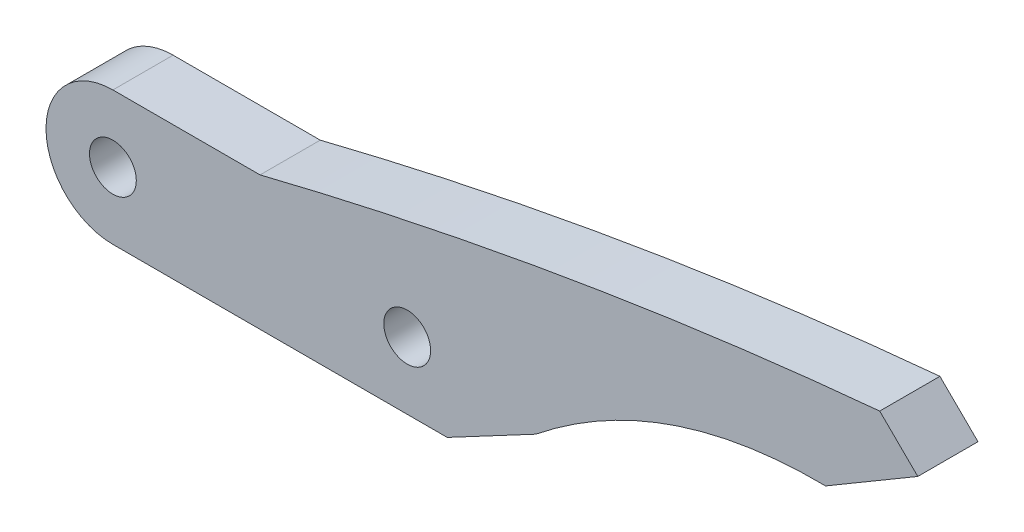
ISO-10303-21;
HEADER;
FILE_DESCRIPTION(('STEP AP214'),'2;1');
FILE_NAME('part.step','',(''),(''),'','','');
FILE_SCHEMA(('AUTOMOTIVE_DESIGN { 1 0 10303 214 1 1 1 1 }'));
ENDSEC;
DATA;
#1=APPLICATION_CONTEXT('core data for automotive mechanical design processes');
#2=APPLICATION_PROTOCOL_DEFINITION('international standard','automotive_design',2000,#1);
#3=PRODUCT_CONTEXT('',#1,'mechanical');
#4=PRODUCT('Part','Part','',(#3));
#5=PRODUCT_RELATED_PRODUCT_CATEGORY('part','',(#4));
#6=PRODUCT_DEFINITION_FORMATION('','',#4);
#7=PRODUCT_DEFINITION_CONTEXT('part definition',#1,'design');
#8=PRODUCT_DEFINITION('design','',#6,#7);
#9=PRODUCT_DEFINITION_SHAPE('','',#8);
#10=(LENGTH_UNIT() NAMED_UNIT(*) SI_UNIT(.MILLI.,.METRE.));
#11=(NAMED_UNIT(*) PLANE_ANGLE_UNIT() SI_UNIT($,.RADIAN.));
#12=(NAMED_UNIT(*) SI_UNIT($,.STERADIAN.) SOLID_ANGLE_UNIT());
#13=UNCERTAINTY_MEASURE_WITH_UNIT(LENGTH_MEASURE(1.E-05),#10,'distance_accuracy_value','');
#14=(GEOMETRIC_REPRESENTATION_CONTEXT(3) GLOBAL_UNCERTAINTY_ASSIGNED_CONTEXT((#13)) GLOBAL_UNIT_ASSIGNED_CONTEXT((#10,
#11,#12)) REPRESENTATION_CONTEXT('',''));
#15=CARTESIAN_POINT('',(0.,0.,0.));
#16=DIRECTION('',(0.,0.,1.));
#17=DIRECTION('',(1.,0.,0.));
#18=AXIS2_PLACEMENT_3D('',#15,#16,#17);
#19=CARTESIAN_POINT('',(0.,-5.,4.5));
#20=DIRECTION('',(0.,1.,0.));
#21=DIRECTION('',(0.,0.,1.));
#22=AXIS2_PLACEMENT_3D('',#19,#20,#21);
#23=PLANE('',#22);
#24=DIRECTION('',(1.,0.,0.));
#25=VECTOR('',#24,1.);
#26=CARTESIAN_POINT('',(0.,-5.,0.));
#27=LINE('',#26,#25);
#28=CARTESIAN_POINT('',(-11.,-5.,0.));
#29=VERTEX_POINT('',#28);
#30=CARTESIAN_POINT('',(13.99,-5.,0.));
#31=VERTEX_POINT('',#30);
#32=EDGE_CURVE('E75',#29,#31,#27,.T.);
#33=ORIENTED_EDGE('',*,*,#32,.T.);
#34=DIRECTION('',(0.,0.,1.));
#35=VECTOR('',#34,1.);
#36=CARTESIAN_POINT('',(13.99,-5.,-52.3102142622293));
#37=LINE('',#36,#35);
#38=CARTESIAN_POINT('',(13.99,-5.,4.5));
#39=VERTEX_POINT('',#38);
#40=EDGE_CURVE('E141',#31,#39,#37,.T.);
#41=ORIENTED_EDGE('',*,*,#40,.T.);
#42=DIRECTION('',(1.,0.,0.));
#43=VECTOR('',#42,1.);
#44=CARTESIAN_POINT('',(0.,-5.,4.5));
#45=LINE('',#44,#43);
#46=CARTESIAN_POINT('',(-11.,-5.,4.5));
#47=VERTEX_POINT('',#46);
#48=EDGE_CURVE('E151',#47,#39,#45,.T.);
#49=ORIENTED_EDGE('',*,*,#48,.F.);
#50=DIRECTION('',(0.,0.,-1.));
#51=VECTOR('',#50,1.);
#52=CARTESIAN_POINT('',(-11.,-5.,4.5));
#53=LINE('',#52,#51);
#54=EDGE_CURVE('E50',#47,#29,#53,.T.);
#55=ORIENTED_EDGE('',*,*,#54,.T.);
#56=EDGE_LOOP('',(#33,#41,#49,#55));
#57=FACE_BOUND('',#56,.T.);
#58=ADVANCED_FACE('F41',(#57),#23,.F.);
#59=CARTESIAN_POINT('',(0.,5.,4.5));
#60=DIRECTION('',(0.,1.,0.));
#61=DIRECTION('',(0.,0.,1.));
#62=AXIS2_PLACEMENT_3D('',#59,#60,#61);
#63=PLANE('',#62);
#64=DIRECTION('',(0.,0.,1.));
#65=VECTOR('',#64,1.);
#66=CARTESIAN_POINT('',(0.,5.,-52.3102142622293));
#67=LINE('',#66,#65);
#68=CARTESIAN_POINT('',(0.,5.,0.));
#69=VERTEX_POINT('',#68);
#70=CARTESIAN_POINT('',(0.,5.,4.5));
#71=VERTEX_POINT('',#70);
#72=EDGE_CURVE('E147',#69,#71,#67,.T.);
#73=ORIENTED_EDGE('',*,*,#72,.F.);
#74=DIRECTION('',(1.,0.,0.));
#75=VECTOR('',#74,1.);
#76=CARTESIAN_POINT('',(0.,5.,0.));
#77=LINE('',#76,#75);
#78=CARTESIAN_POINT('',(-11.,5.,0.));
#79=VERTEX_POINT('',#78);
#80=EDGE_CURVE('E171',#79,#69,#77,.T.);
#81=ORIENTED_EDGE('',*,*,#80,.F.);
#82=DIRECTION('',(0.,0.,-1.));
#83=VECTOR('',#82,1.);
#84=CARTESIAN_POINT('',(-11.,5.,4.5));
#85=LINE('',#84,#83);
#86=CARTESIAN_POINT('',(-11.,5.,4.5));
#87=VERTEX_POINT('',#86);
#88=EDGE_CURVE('E11',#87,#79,#85,.T.);
#89=ORIENTED_EDGE('',*,*,#88,.F.);
#90=DIRECTION('',(1.,0.,0.));
#91=VECTOR('',#90,1.);
#92=CARTESIAN_POINT('',(0.,5.,4.5));
#93=LINE('',#92,#91);
#94=EDGE_CURVE('E154',#87,#71,#93,.T.);
#95=ORIENTED_EDGE('',*,*,#94,.T.);
#96=EDGE_LOOP('',(#73,#81,#89,#95));
#97=FACE_BOUND('',#96,.T.);
#98=ADVANCED_FACE('F255',(#97),#63,.T.);
#99=CARTESIAN_POINT('',(-11.,0.,4.5));
#100=DIRECTION('',(0.,0.,-1.));
#101=DIRECTION('',(-1.,0.,0.));
#102=AXIS2_PLACEMENT_3D('',#99,#100,#101);
#103=CYLINDRICAL_SURFACE('',#102,1.75);
#104=CARTESIAN_POINT('',(-11.,0.,4.5));
#105=DIRECTION('',(0.,0.,1.));
#106=DIRECTION('',(1.,0.,0.));
#107=AXIS2_PLACEMENT_3D('',#104,#105,#106);
#108=CIRCLE('',#107,1.75);
#109=CARTESIAN_POINT('',(-9.25,0.,4.5));
#110=VERTEX_POINT('',#109);
#111=EDGE_CURVE('E161',#110,#110,#108,.T.);
#112=ORIENTED_EDGE('',*,*,#111,.T.);
#113=EDGE_LOOP('',(#112));
#114=FACE_BOUND('',#113,.T.);
#115=CARTESIAN_POINT('',(-11.,0.,0.));
#116=DIRECTION('',(0.,0.,1.));
#117=DIRECTION('',(1.,0.,0.));
#118=AXIS2_PLACEMENT_3D('',#115,#116,#117);
#119=CIRCLE('',#118,1.75);
#120=CARTESIAN_POINT('',(-9.25,0.,0.));
#121=VERTEX_POINT('',#120);
#122=EDGE_CURVE('E177',#121,#121,#119,.T.);
#123=ORIENTED_EDGE('',*,*,#122,.F.);
#124=EDGE_LOOP('',(#123));
#125=FACE_BOUND('',#124,.T.);
#126=ADVANCED_FACE('F252',(#114,#125),#103,.F.);
#127=CARTESIAN_POINT('',(-11.,0.,4.5));
#128=DIRECTION('',(0.,0.,-1.));
#129=DIRECTION('',(-1.,0.,0.));
#130=AXIS2_PLACEMENT_3D('',#127,#128,#129);
#131=CYLINDRICAL_SURFACE('',#130,5.);
#132=CARTESIAN_POINT('',(-11.,0.,0.));
#133=DIRECTION('',(0.,0.,1.));
#134=DIRECTION('',(1.,0.,0.));
#135=AXIS2_PLACEMENT_3D('',#132,#133,#134);
#136=CIRCLE('',#135,5.);
#137=EDGE_CURVE('E174',#79,#29,#136,.T.);
#138=ORIENTED_EDGE('',*,*,#137,.T.);
#139=ORIENTED_EDGE('',*,*,#54,.F.);
#140=CARTESIAN_POINT('',(-11.,0.,4.5));
#141=DIRECTION('',(0.,0.,1.));
#142=DIRECTION('',(1.,0.,0.));
#143=AXIS2_PLACEMENT_3D('',#140,#141,#142);
#144=CIRCLE('',#143,5.);
#145=EDGE_CURVE('E58',#87,#47,#144,.T.);
#146=ORIENTED_EDGE('',*,*,#145,.F.);
#147=ORIENTED_EDGE('',*,*,#88,.T.);
#148=EDGE_LOOP('',(#138,#139,#146,#147));
#149=FACE_BOUND('',#148,.T.);
#150=ADVANCED_FACE('F250',(#149),#131,.T.);
#151=CARTESIAN_POINT('',(11.,0.,4.5));
#152=DIRECTION('',(0.,0.,-1.));
#153=DIRECTION('',(-1.,0.,0.));
#154=AXIS2_PLACEMENT_3D('',#151,#152,#153);
#155=CYLINDRICAL_SURFACE('',#154,1.75);
#156=CARTESIAN_POINT('',(11.,0.,4.5));
#157=DIRECTION('',(0.,0.,1.));
#158=DIRECTION('',(1.,0.,0.));
#159=AXIS2_PLACEMENT_3D('',#156,#157,#158);
#160=CIRCLE('',#159,1.75);
#161=CARTESIAN_POINT('',(12.75,0.,4.5));
#162=VERTEX_POINT('',#161);
#163=EDGE_CURVE('E165',#162,#162,#160,.F.);
#164=ORIENTED_EDGE('',*,*,#163,.F.);
#165=EDGE_LOOP('',(#164));
#166=FACE_BOUND('',#165,.T.);
#167=CARTESIAN_POINT('',(11.,0.,0.));
#168=DIRECTION('',(0.,0.,1.));
#169=DIRECTION('',(1.,0.,0.));
#170=AXIS2_PLACEMENT_3D('',#167,#168,#169);
#171=CIRCLE('',#170,1.75);
#172=CARTESIAN_POINT('',(12.75,0.,0.));
#173=VERTEX_POINT('',#172);
#174=EDGE_CURVE('E155',#173,#173,#171,.F.);
#175=ORIENTED_EDGE('',*,*,#174,.T.);
#176=EDGE_LOOP('',(#175));
#177=FACE_BOUND('',#176,.T.);
#178=ADVANCED_FACE('F245',(#166,#177),#155,.F.);
#179=CARTESIAN_POINT('',(0.,0.,4.5));
#180=DIRECTION('',(0.,0.,1.));
#181=DIRECTION('',(1.,0.,0.));
#182=AXIS2_PLACEMENT_3D('',#179,#180,#181);
#183=PLANE('',#182);
#184=ORIENTED_EDGE('',*,*,#48,.T.);
#185=DIRECTION('',(0.882942972945771,0.469480251475697,0.));
#186=VECTOR('',#185,1.);
#187=CARTESIAN_POINT('',(20.61,-1.48,4.5));
#188=LINE('',#187,#186);
#189=CARTESIAN_POINT('',(20.61,-1.48,4.5));
#190=VERTEX_POINT('',#189);
#191=EDGE_CURVE('E194',#39,#190,#188,.T.);
#192=ORIENTED_EDGE('',*,*,#191,.T.);
#193=CARTESIAN_POINT('',(20.61,-1.48,4.5));
#194=CARTESIAN_POINT('',(30.1461507480521,6.15734830451268,4.5));
#195=CARTESIAN_POINT('',(42.27,6.,4.5));
#196=B_SPLINE_CURVE_WITH_KNOTS('',2,(#193,#194,#195),.UNSPECIFIED.,.F.,.F.,(3,3),(0.,1.),.UNSPECIFIED.);
#197=CARTESIAN_POINT('',(42.27,6.,4.5));
#198=VERTEX_POINT('',#197);
#199=EDGE_CURVE('E207',#190,#198,#196,.T.);
#200=ORIENTED_EDGE('',*,*,#199,.T.);
#201=DIRECTION('',(0.861651756802016,0.5075,0.));
#202=VECTOR('',#201,1.);
#203=CARTESIAN_POINT('',(49.1632140544161,10.06,4.5));
#204=LINE('',#203,#202);
#205=CARTESIAN_POINT('',(49.1632140544161,10.06,4.5));
#206=VERTEX_POINT('',#205);
#207=EDGE_CURVE('E132',#198,#206,#204,.T.);
#208=ORIENTED_EDGE('',*,*,#207,.T.);
#209=DIRECTION('',(-0.711683742964528,0.7025,0.));
#210=VECTOR('',#209,1.);
#211=CARTESIAN_POINT('',(46.316479082558,12.87,4.5));
#212=LINE('',#211,#210);
#213=CARTESIAN_POINT('',(46.316479082558,12.87,4.5));
#214=VERTEX_POINT('',#213);
#215=EDGE_CURVE('E150',#206,#214,#212,.T.);
#216=ORIENTED_EDGE('',*,*,#215,.T.);
#217=CARTESIAN_POINT('',(46.316479082558,12.87,4.5));
#218=CARTESIAN_POINT('',(22.862881716216,10.6997424397995,4.5));
#219=CARTESIAN_POINT('',(0.,5.,4.5));
#220=B_SPLINE_CURVE_WITH_KNOTS('',2,(#217,#218,#219),.UNSPECIFIED.,.F.,.F.,(3,3),(0.,1.),.UNSPECIFIED.);
#221=EDGE_CURVE('E263',#214,#71,#220,.T.);
#222=ORIENTED_EDGE('',*,*,#221,.T.);
#223=ORIENTED_EDGE('',*,*,#94,.F.);
#224=ORIENTED_EDGE('',*,*,#145,.T.);
#225=EDGE_LOOP('',(#184,#192,#200,#208,#216,#222,#223,#224));
#226=FACE_BOUND('',#225,.T.);
#227=ORIENTED_EDGE('',*,*,#111,.F.);
#228=EDGE_LOOP('',(#227));
#229=FACE_BOUND('',#228,.T.);
#230=ORIENTED_EDGE('',*,*,#163,.T.);
#231=EDGE_LOOP('',(#230));
#232=FACE_BOUND('',#231,.T.);
#233=ADVANCED_FACE('F204',(#226,#229,#232),#183,.T.);
#234=CARTESIAN_POINT('',(0.,0.,0.));
#235=DIRECTION('',(0.,0.,1.));
#236=DIRECTION('',(1.,0.,0.));
#237=AXIS2_PLACEMENT_3D('',#234,#235,#236);
#238=PLANE('',#237);
#239=DIRECTION('',(-0.882942972945771,-0.469480251475697,0.));
#240=VECTOR('',#239,1.);
#241=CARTESIAN_POINT('',(20.61,-1.48,0.));
#242=LINE('',#241,#240);
#243=CARTESIAN_POINT('',(20.61,-1.48,0.));
#244=VERTEX_POINT('',#243);
#245=EDGE_CURVE('E128',#244,#31,#242,.T.);
#246=ORIENTED_EDGE('',*,*,#245,.T.);
#247=ORIENTED_EDGE('',*,*,#32,.F.);
#248=ORIENTED_EDGE('',*,*,#137,.F.);
#249=ORIENTED_EDGE('',*,*,#80,.T.);
#250=CARTESIAN_POINT('',(46.316479082558,12.87,0.));
#251=CARTESIAN_POINT('',(22.862881716216,10.6997424397995,0.));
#252=CARTESIAN_POINT('',(0.,5.,0.));
#253=B_SPLINE_CURVE_WITH_KNOTS('',2,(#250,#251,#252),.UNSPECIFIED.,.F.,.F.,(3,3),(0.,1.),.UNSPECIFIED.);
#254=CARTESIAN_POINT('',(46.316479082558,12.87,0.));
#255=VERTEX_POINT('',#254);
#256=EDGE_CURVE('E89',#69,#255,#253,.F.);
#257=ORIENTED_EDGE('',*,*,#256,.T.);
#258=DIRECTION('',(0.711683742964528,-0.7025,0.));
#259=VECTOR('',#258,1.);
#260=CARTESIAN_POINT('',(46.316479082558,12.87,0.));
#261=LINE('',#260,#259);
#262=CARTESIAN_POINT('',(49.1632140544161,10.06,0.));
#263=VERTEX_POINT('',#262);
#264=EDGE_CURVE('E110',#255,#263,#261,.T.);
#265=ORIENTED_EDGE('',*,*,#264,.T.);
#266=DIRECTION('',(-0.861651756802016,-0.5075,0.));
#267=VECTOR('',#266,1.);
#268=CARTESIAN_POINT('',(49.1632140544161,10.06,0.));
#269=LINE('',#268,#267);
#270=CARTESIAN_POINT('',(42.27,6.,0.));
#271=VERTEX_POINT('',#270);
#272=EDGE_CURVE('E104',#263,#271,#269,.T.);
#273=ORIENTED_EDGE('',*,*,#272,.T.);
#274=CARTESIAN_POINT('',(20.61,-1.48,0.));
#275=CARTESIAN_POINT('',(30.1461507480521,6.15734830451268,0.));
#276=CARTESIAN_POINT('',(42.27,6.,0.));
#277=B_SPLINE_CURVE_WITH_KNOTS('',2,(#274,#275,#276),.UNSPECIFIED.,.F.,.F.,(3,3),(0.,1.),.UNSPECIFIED.);
#278=EDGE_CURVE('E108',#271,#244,#277,.F.);
#279=ORIENTED_EDGE('',*,*,#278,.T.);
#280=EDGE_LOOP('',(#246,#247,#248,#249,#257,#265,#273,#279));
#281=FACE_BOUND('',#280,.T.);
#282=ORIENTED_EDGE('',*,*,#122,.T.);
#283=EDGE_LOOP('',(#282));
#284=FACE_BOUND('',#283,.T.);
#285=ORIENTED_EDGE('',*,*,#174,.F.);
#286=EDGE_LOOP('',(#285));
#287=FACE_BOUND('',#286,.T.);
#288=ADVANCED_FACE('F106',(#281,#284,#287),#238,.F.);
#289=CARTESIAN_POINT('',(46.316479082558,12.87,-52.3102142622293));
#290=CARTESIAN_POINT('',(22.862881716216,10.6997424397995,-52.3102142622293));
#291=CARTESIAN_POINT('',(0.,5.,-52.3102142622293));
#292=B_SPLINE_CURVE_WITH_KNOTS('',2,(#289,#290,#291),.UNSPECIFIED.,.F.,.F.,(3,3),(0.,1.),.UNSPECIFIED.);
#293=DIRECTION('',(0.,0.,1.));
#294=VECTOR('',#293,1.);
#295=SURFACE_OF_LINEAR_EXTRUSION('',#292,#294);
#296=ORIENTED_EDGE('',*,*,#256,.F.);
#297=ORIENTED_EDGE('',*,*,#72,.T.);
#298=ORIENTED_EDGE('',*,*,#221,.F.);
#299=DIRECTION('',(0.,0.,1.));
#300=VECTOR('',#299,1.);
#301=CARTESIAN_POINT('',(46.316479082558,12.87,-52.3102142622293));
#302=LINE('',#301,#300);
#303=EDGE_CURVE('E139',#255,#214,#302,.T.);
#304=ORIENTED_EDGE('',*,*,#303,.F.);
#305=EDGE_LOOP('',(#296,#297,#298,#304));
#306=FACE_BOUND('',#305,.T.);
#307=ADVANCED_FACE('F238',(#306),#295,.T.);
#308=CARTESIAN_POINT('',(46.316479082558,12.87,-52.3102142622293));
#309=DIRECTION('',(0.7025,0.711683742964528,0.));
#310=DIRECTION('',(-0.711683742964528,0.7025,0.));
#311=AXIS2_PLACEMENT_3D('',#308,#309,#310);
#312=PLANE('',#311);
#313=ORIENTED_EDGE('',*,*,#264,.F.);
#314=ORIENTED_EDGE('',*,*,#303,.T.);
#315=ORIENTED_EDGE('',*,*,#215,.F.);
#316=DIRECTION('',(0.,0.,1.));
#317=VECTOR('',#316,1.);
#318=CARTESIAN_POINT('',(49.1632140544161,10.06,-52.3102142622293));
#319=LINE('',#318,#317);
#320=EDGE_CURVE('E135',#263,#206,#319,.T.);
#321=ORIENTED_EDGE('',*,*,#320,.F.);
#322=EDGE_LOOP('',(#313,#314,#315,#321));
#323=FACE_BOUND('',#322,.T.);
#324=ADVANCED_FACE('F210',(#323),#312,.T.);
#325=CARTESIAN_POINT('',(49.1632140544161,10.06,-52.3102142622293));
#326=DIRECTION('',(0.5075,-0.861651756802016,0.));
#327=DIRECTION('',(0.861651756802016,0.5075,0.));
#328=AXIS2_PLACEMENT_3D('',#325,#326,#327);
#329=PLANE('',#328);
#330=ORIENTED_EDGE('',*,*,#272,.F.);
#331=ORIENTED_EDGE('',*,*,#320,.T.);
#332=ORIENTED_EDGE('',*,*,#207,.F.);
#333=DIRECTION('',(0.,0.,1.));
#334=VECTOR('',#333,1.);
#335=CARTESIAN_POINT('',(42.27,6.,-52.3102142622293));
#336=LINE('',#335,#334);
#337=EDGE_CURVE('E123',#271,#198,#336,.T.);
#338=ORIENTED_EDGE('',*,*,#337,.F.);
#339=EDGE_LOOP('',(#330,#331,#332,#338));
#340=FACE_BOUND('',#339,.T.);
#341=ADVANCED_FACE('F130',(#340),#329,.T.);
#342=CARTESIAN_POINT('',(20.61,-1.48,-52.3102142622293));
#343=CARTESIAN_POINT('',(30.1461507480521,6.15734830451268,-52.3102142622293));
#344=CARTESIAN_POINT('',(42.27,6.,-52.3102142622293));
#345=B_SPLINE_CURVE_WITH_KNOTS('',2,(#342,#343,#344),.UNSPECIFIED.,.F.,.F.,(3,3),(0.,1.),.UNSPECIFIED.);
#346=DIRECTION('',(0.,0.,1.));
#347=VECTOR('',#346,1.);
#348=SURFACE_OF_LINEAR_EXTRUSION('',#345,#347);
#349=ORIENTED_EDGE('',*,*,#278,.F.);
#350=ORIENTED_EDGE('',*,*,#337,.T.);
#351=ORIENTED_EDGE('',*,*,#199,.F.);
#352=DIRECTION('',(0.,0.,1.));
#353=VECTOR('',#352,1.);
#354=CARTESIAN_POINT('',(20.61,-1.48,-52.3102142622293));
#355=LINE('',#354,#353);
#356=EDGE_CURVE('E126',#244,#190,#355,.T.);
#357=ORIENTED_EDGE('',*,*,#356,.F.);
#358=EDGE_LOOP('',(#349,#350,#351,#357));
#359=FACE_BOUND('',#358,.T.);
#360=ADVANCED_FACE('F120',(#359),#348,.T.);
#361=CARTESIAN_POINT('',(20.61,-1.48,-52.3102142622293));
#362=DIRECTION('',(0.469480251475697,-0.882942972945771,0.));
#363=DIRECTION('',(0.882942972945771,0.469480251475697,0.));
#364=AXIS2_PLACEMENT_3D('',#361,#362,#363);
#365=PLANE('',#364);
#366=ORIENTED_EDGE('',*,*,#245,.F.);
#367=ORIENTED_EDGE('',*,*,#356,.T.);
#368=ORIENTED_EDGE('',*,*,#191,.F.);
#369=ORIENTED_EDGE('',*,*,#40,.F.);
#370=EDGE_LOOP('',(#366,#367,#368,#369));
#371=FACE_BOUND('',#370,.T.);
#372=ADVANCED_FACE('F191',(#371),#365,.T.);
#373=CLOSED_SHELL('',(#58,#98,#126,#150,#178,#233,#288,#307,#324,#341,#360,#372));
#374=MANIFOLD_SOLID_BREP('B2',#373);
#375=ADVANCED_BREP_SHAPE_REPRESENTATION('',(#18,#374),#14);
#376=SHAPE_DEFINITION_REPRESENTATION(#9,#375);
ENDSEC;
END-ISO-10303-21;
